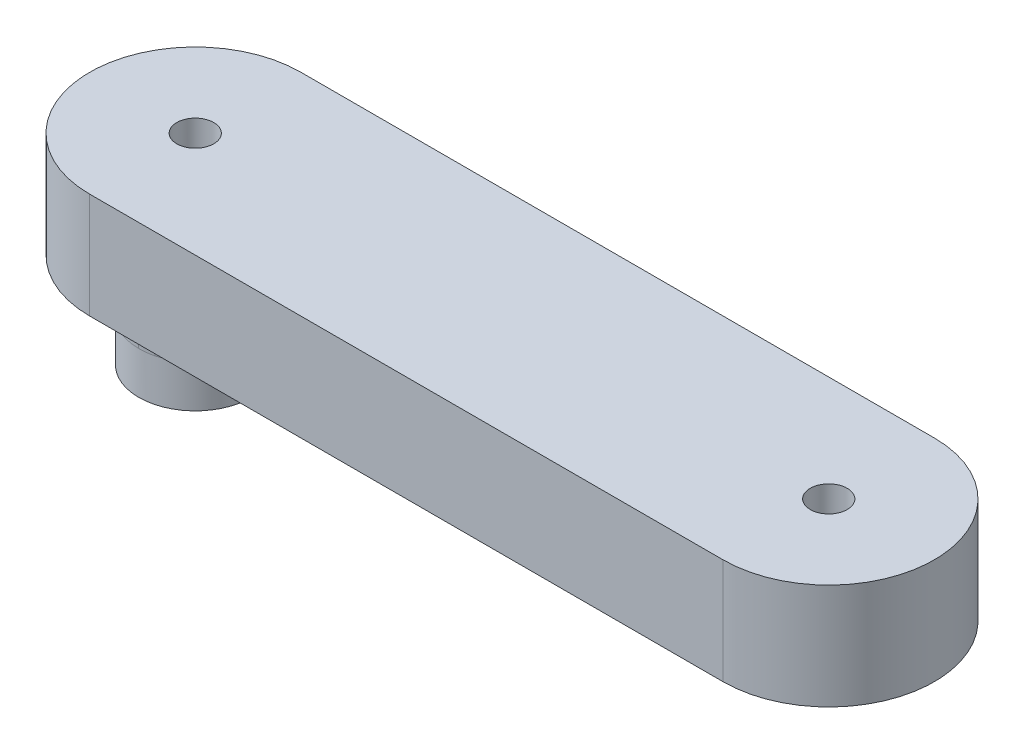
ISO-10303-21;
HEADER;
FILE_DESCRIPTION(('STEP AP214'),'2;1');
FILE_NAME('part.step','',(''),(''),'','','');
FILE_SCHEMA(('AUTOMOTIVE_DESIGN { 1 0 10303 214 1 1 1 1 }'));
ENDSEC;
DATA;
#1=APPLICATION_CONTEXT('core data for automotive mechanical design processes');
#2=APPLICATION_PROTOCOL_DEFINITION('international standard','automotive_design',2000,#1);
#3=PRODUCT_CONTEXT('',#1,'mechanical');
#4=PRODUCT('Part','Part','',(#3));
#5=PRODUCT_RELATED_PRODUCT_CATEGORY('part','',(#4));
#6=PRODUCT_DEFINITION_FORMATION('','',#4);
#7=PRODUCT_DEFINITION_CONTEXT('part definition',#1,'design');
#8=PRODUCT_DEFINITION('design','',#6,#7);
#9=PRODUCT_DEFINITION_SHAPE('','',#8);
#10=(LENGTH_UNIT() NAMED_UNIT(*) SI_UNIT(.MILLI.,.METRE.));
#11=(NAMED_UNIT(*) PLANE_ANGLE_UNIT() SI_UNIT($,.RADIAN.));
#12=(NAMED_UNIT(*) SI_UNIT($,.STERADIAN.) SOLID_ANGLE_UNIT());
#13=UNCERTAINTY_MEASURE_WITH_UNIT(LENGTH_MEASURE(1.E-05),#10,'distance_accuracy_value','');
#14=(GEOMETRIC_REPRESENTATION_CONTEXT(3) GLOBAL_UNCERTAINTY_ASSIGNED_CONTEXT((#13)) GLOBAL_UNIT_ASSIGNED_CONTEXT((#10,
#11,#12)) REPRESENTATION_CONTEXT('',''));
#15=CARTESIAN_POINT('',(0.,0.,0.));
#16=DIRECTION('',(0.,0.,1.));
#17=DIRECTION('',(1.,0.,0.));
#18=AXIS2_PLACEMENT_3D('',#15,#16,#17);
#19=CARTESIAN_POINT('',(-30.,10.,0.));
#20=DIRECTION('',(0.,-1.,0.));
#21=DIRECTION('',(0.,0.,1.));
#22=AXIS2_PLACEMENT_3D('',#19,#20,#21);
#23=CYLINDRICAL_SURFACE('',#22,10.);
#24=CARTESIAN_POINT('',(-30.,0.,0.));
#25=DIRECTION('',(0.,-1.,0.));
#26=DIRECTION('',(0.,0.,-1.));
#27=AXIS2_PLACEMENT_3D('',#24,#25,#26);
#28=CIRCLE('',#27,10.);
#29=CARTESIAN_POINT('',(-30.,0.,10.));
#30=VERTEX_POINT('',#29);
#31=CARTESIAN_POINT('',(-30.,0.,-10.));
#32=VERTEX_POINT('',#31);
#33=EDGE_CURVE('E149',#30,#32,#28,.T.);
#34=ORIENTED_EDGE('',*,*,#33,.F.);
#35=DIRECTION('',(0.,-1.,0.));
#36=VECTOR('',#35,1.);
#37=CARTESIAN_POINT('',(-30.,10.,10.));
#38=LINE('',#37,#36);
#39=CARTESIAN_POINT('',(-30.,10.,10.));
#40=VERTEX_POINT('',#39);
#41=EDGE_CURVE('E136',#40,#30,#38,.T.);
#42=ORIENTED_EDGE('',*,*,#41,.F.);
#43=CARTESIAN_POINT('',(-30.,10.,0.));
#44=DIRECTION('',(0.,-1.,0.));
#45=DIRECTION('',(0.,0.,-1.));
#46=AXIS2_PLACEMENT_3D('',#43,#44,#45);
#47=CIRCLE('',#46,10.);
#48=CARTESIAN_POINT('',(-30.,10.,-10.));
#49=VERTEX_POINT('',#48);
#50=EDGE_CURVE('E114',#40,#49,#47,.T.);
#51=ORIENTED_EDGE('',*,*,#50,.T.);
#52=DIRECTION('',(0.,-1.,0.));
#53=VECTOR('',#52,1.);
#54=CARTESIAN_POINT('',(-30.,10.,-10.));
#55=LINE('',#54,#53);
#56=EDGE_CURVE('E124',#49,#32,#55,.T.);
#57=ORIENTED_EDGE('',*,*,#56,.T.);
#58=EDGE_LOOP('',(#34,#42,#51,#57));
#59=FACE_BOUND('',#58,.T.);
#60=ADVANCED_FACE('F45',(#59),#23,.T.);
#61=CARTESIAN_POINT('',(-30.,10.,-10.));
#62=DIRECTION('',(0.,0.,1.));
#63=DIRECTION('',(-1.,0.,0.));
#64=AXIS2_PLACEMENT_3D('',#61,#62,#63);
#65=PLANE('',#64);
#66=DIRECTION('',(1.,0.,0.));
#67=VECTOR('',#66,1.);
#68=CARTESIAN_POINT('',(-30.,0.,-10.));
#69=LINE('',#68,#67);
#70=CARTESIAN_POINT('',(-27.3311987709835,0.,-10.));
#71=VERTEX_POINT('',#70);
#72=EDGE_CURVE('E128',#32,#71,#69,.T.);
#73=ORIENTED_EDGE('',*,*,#72,.F.);
#74=ORIENTED_EDGE('',*,*,#56,.F.);
#75=DIRECTION('',(1.,0.,0.));
#76=VECTOR('',#75,1.);
#77=CARTESIAN_POINT('',(-30.,10.,-10.));
#78=LINE('',#77,#76);
#79=CARTESIAN_POINT('',(30.,10.,-9.99999999999999));
#80=VERTEX_POINT('',#79);
#81=EDGE_CURVE('E110',#49,#80,#78,.T.);
#82=ORIENTED_EDGE('',*,*,#81,.T.);
#83=DIRECTION('',(0.,-1.,0.));
#84=VECTOR('',#83,1.);
#85=CARTESIAN_POINT('',(30.,10.,-9.99999999999999));
#86=LINE('',#85,#84);
#87=CARTESIAN_POINT('',(30.,0.,-9.99999999999999));
#88=VERTEX_POINT('',#87);
#89=EDGE_CURVE('E133',#80,#88,#86,.T.);
#90=ORIENTED_EDGE('',*,*,#89,.T.);
#91=EDGE_CURVE('E151',#71,#88,#69,.T.);
#92=ORIENTED_EDGE('',*,*,#91,.F.);
#93=EDGE_LOOP('',(#73,#74,#82,#90,#92));
#94=FACE_BOUND('',#93,.T.);
#95=ADVANCED_FACE('F125',(#94),#65,.F.);
#96=CARTESIAN_POINT('',(30.,10.,0.));
#97=DIRECTION('',(0.,-1.,0.));
#98=DIRECTION('',(0.,0.,1.));
#99=AXIS2_PLACEMENT_3D('',#96,#97,#98);
#100=CYLINDRICAL_SURFACE('',#99,10.);
#101=CARTESIAN_POINT('',(30.,0.,0.));
#102=DIRECTION('',(0.,-1.,0.));
#103=DIRECTION('',(0.,0.,-1.));
#104=AXIS2_PLACEMENT_3D('',#101,#102,#103);
#105=CIRCLE('',#104,10.);
#106=CARTESIAN_POINT('',(30.,0.,10.));
#107=VERTEX_POINT('',#106);
#108=EDGE_CURVE('E153',#88,#107,#105,.T.);
#109=ORIENTED_EDGE('',*,*,#108,.F.);
#110=ORIENTED_EDGE('',*,*,#89,.F.);
#111=CARTESIAN_POINT('',(30.,10.,0.));
#112=DIRECTION('',(0.,-1.,0.));
#113=DIRECTION('',(0.,0.,-1.));
#114=AXIS2_PLACEMENT_3D('',#111,#112,#113);
#115=CIRCLE('',#114,10.);
#116=CARTESIAN_POINT('',(30.,10.,10.));
#117=VERTEX_POINT('',#116);
#118=EDGE_CURVE('E117',#80,#117,#115,.T.);
#119=ORIENTED_EDGE('',*,*,#118,.T.);
#120=DIRECTION('',(0.,-1.,0.));
#121=VECTOR('',#120,1.);
#122=CARTESIAN_POINT('',(30.,10.,10.));
#123=LINE('',#122,#121);
#124=EDGE_CURVE('E157',#117,#107,#123,.T.);
#125=ORIENTED_EDGE('',*,*,#124,.T.);
#126=EDGE_LOOP('',(#109,#110,#119,#125));
#127=FACE_BOUND('',#126,.T.);
#128=ADVANCED_FACE('F231',(#127),#100,.T.);
#129=CARTESIAN_POINT('',(-30.,10.,10.));
#130=DIRECTION('',(0.,0.,-1.));
#131=DIRECTION('',(1.,0.,0.));
#132=AXIS2_PLACEMENT_3D('',#129,#130,#131);
#133=PLANE('',#132);
#134=DIRECTION('',(-1.,0.,0.));
#135=VECTOR('',#134,1.);
#136=CARTESIAN_POINT('',(-30.,0.,10.));
#137=LINE('',#136,#135);
#138=CARTESIAN_POINT('',(-27.3311987709835,0.,10.));
#139=VERTEX_POINT('',#138);
#140=EDGE_CURVE('E137',#107,#139,#137,.T.);
#141=ORIENTED_EDGE('',*,*,#140,.F.);
#142=ORIENTED_EDGE('',*,*,#124,.F.);
#143=DIRECTION('',(-1.,0.,0.));
#144=VECTOR('',#143,1.);
#145=CARTESIAN_POINT('',(-30.,10.,10.));
#146=LINE('',#145,#144);
#147=EDGE_CURVE('E147',#117,#40,#146,.T.);
#148=ORIENTED_EDGE('',*,*,#147,.T.);
#149=ORIENTED_EDGE('',*,*,#41,.T.);
#150=EDGE_CURVE('E140',#139,#30,#137,.T.);
#151=ORIENTED_EDGE('',*,*,#150,.F.);
#152=EDGE_LOOP('',(#141,#142,#148,#149,#151));
#153=FACE_BOUND('',#152,.T.);
#154=ADVANCED_FACE('F205',(#153),#133,.F.);
#155=CARTESIAN_POINT('',(-30.,10.,0.));
#156=DIRECTION('',(0.,1.,0.));
#157=DIRECTION('',(0.,0.,-1.));
#158=AXIS2_PLACEMENT_3D('',#155,#156,#157);
#159=PLANE('',#158);
#160=CARTESIAN_POINT('',(-30.,10.,0.));
#161=DIRECTION('',(0.,-1.,0.));
#162=DIRECTION('',(0.,0.,-1.));
#163=AXIS2_PLACEMENT_3D('',#160,#161,#162);
#164=CIRCLE('',#163,1.75);
#165=CARTESIAN_POINT('',(-30.,10.,-1.75));
#166=VERTEX_POINT('',#165);
#167=EDGE_CURVE('E349',#166,#166,#164,.F.);
#168=ORIENTED_EDGE('',*,*,#167,.F.);
#169=EDGE_LOOP('',(#168));
#170=FACE_BOUND('',#169,.T.);
#171=CARTESIAN_POINT('',(30.,10.,0.));
#172=DIRECTION('',(0.,-1.,0.));
#173=DIRECTION('',(0.,0.,-1.));
#174=AXIS2_PLACEMENT_3D('',#171,#172,#173);
#175=CIRCLE('',#174,1.75);
#176=CARTESIAN_POINT('',(30.,10.,-1.74999999999999));
#177=VERTEX_POINT('',#176);
#178=EDGE_CURVE('E359',#177,#177,#175,.T.);
#179=ORIENTED_EDGE('',*,*,#178,.T.);
#180=EDGE_LOOP('',(#179));
#181=FACE_BOUND('',#180,.T.);
#182=ORIENTED_EDGE('',*,*,#50,.F.);
#183=ORIENTED_EDGE('',*,*,#147,.F.);
#184=ORIENTED_EDGE('',*,*,#118,.F.);
#185=ORIENTED_EDGE('',*,*,#81,.F.);
#186=EDGE_LOOP('',(#182,#183,#184,#185));
#187=FACE_BOUND('',#186,.T.);
#188=ADVANCED_FACE('F112',(#170,#181,#187),#159,.T.);
#189=CARTESIAN_POINT('',(-30.,0.,0.));
#190=DIRECTION('',(0.,1.,0.));
#191=DIRECTION('',(0.,0.,-1.));
#192=AXIS2_PLACEMENT_3D('',#189,#190,#191);
#193=PLANE('',#192);
#194=CARTESIAN_POINT('',(30.,0.,0.));
#195=DIRECTION('',(0.,-1.,0.));
#196=DIRECTION('',(0.,0.,-1.));
#197=AXIS2_PLACEMENT_3D('',#194,#195,#196);
#198=CIRCLE('',#197,1.75);
#199=CARTESIAN_POINT('',(30.,0.,-1.74999999999999));
#200=VERTEX_POINT('',#199);
#201=EDGE_CURVE('E143',#200,#200,#198,.F.);
#202=ORIENTED_EDGE('',*,*,#201,.T.);
#203=EDGE_LOOP('',(#202));
#204=FACE_BOUND('',#203,.T.);
#205=ORIENTED_EDGE('',*,*,#91,.T.);
#206=ORIENTED_EDGE('',*,*,#108,.T.);
#207=ORIENTED_EDGE('',*,*,#140,.T.);
#208=CARTESIAN_POINT('',(-30.,0.,0.));
#209=DIRECTION('',(0.,-1.,0.));
#210=DIRECTION('',(0.,0.,-1.));
#211=AXIS2_PLACEMENT_3D('',#208,#209,#210);
#212=CIRCLE('',#211,10.35);
#213=EDGE_CURVE('E11',#71,#139,#212,.T.);
#214=ORIENTED_EDGE('',*,*,#213,.F.);
#215=EDGE_LOOP('',(#205,#206,#207,#214));
#216=FACE_BOUND('',#215,.T.);
#217=ADVANCED_FACE('F208',(#204,#216),#193,.F.);
#218=CARTESIAN_POINT('',(30.,-0.000999999999999265,0.));
#219=DIRECTION('',(0.,1.,0.));
#220=DIRECTION('',(0.,0.,-1.));
#221=AXIS2_PLACEMENT_3D('',#218,#219,#220);
#222=CYLINDRICAL_SURFACE('',#221,1.75);
#223=ORIENTED_EDGE('',*,*,#178,.F.);
#224=EDGE_LOOP('',(#223));
#225=FACE_BOUND('',#224,.T.);
#226=ORIENTED_EDGE('',*,*,#201,.F.);
#227=EDGE_LOOP('',(#226));
#228=FACE_BOUND('',#227,.T.);
#229=ADVANCED_FACE('F182',(#225,#228),#222,.F.);
#230=CARTESIAN_POINT('',(-30.,-9.,0.));
#231=DIRECTION('',(0.,1.,0.));
#232=DIRECTION('',(0.,0.,-1.));
#233=AXIS2_PLACEMENT_3D('',#230,#231,#232);
#234=CYLINDRICAL_SURFACE('',#233,5.35);
#235=CARTESIAN_POINT('',(-30.,-5.,0.));
#236=DIRECTION('',(0.,-1.,0.));
#237=DIRECTION('',(0.,0.,-1.));
#238=AXIS2_PLACEMENT_3D('',#235,#236,#237);
#239=CIRCLE('',#238,5.35);
#240=CARTESIAN_POINT('',(-28.6204747270301,-5.,5.16908212560387));
#241=VERTEX_POINT('',#240);
#242=CARTESIAN_POINT('',(-28.6204747270301,-5.,-5.16908212560387));
#243=VERTEX_POINT('',#242);
#244=EDGE_CURVE('E132',#241,#243,#239,.F.);
#245=ORIENTED_EDGE('',*,*,#244,.F.);
#246=CARTESIAN_POINT('',(-31.9788555023003,0.,10.));
#247=CARTESIAN_POINT('',(-31.0518342041425,-0.151327584497428,5.24566626475481));
#248=CARTESIAN_POINT('',(-31.0228866606093,-4.99746914629356,5.25130487398585));
#249=CARTESIAN_POINT('',(-31.8416840938048,0.,10.));
#250=CARTESIAN_POINT('',(-30.9838925193806,-0.17627521969813,5.25932344975121));
#251=CARTESIAN_POINT('',(-30.9519816330296,-4.99661173471191,5.26511615605325));
#252=CARTESIAN_POINT('',(-31.7039879760669,0.,10.));
#253=CARTESIAN_POINT('',(-30.9139269500573,-0.198492678012402,5.27196649699026));
#254=CARTESIAN_POINT('',(-30.8808053789332,-4.9956432876798,5.27748969279492));
#255=CARTESIAN_POINT('',(-31.4277388486444,0.,10.));
#256=CARTESIAN_POINT('',(-30.7712171581687,-0.237452741214783,5.29471475920545));
#257=CARTESIAN_POINT('',(-30.7380099362557,-4.99369141658507,5.29934522958744));
#258=CARTESIAN_POINT('',(-31.2891858339339,0.,10.));
#259=CARTESIAN_POINT('',(-30.6984091257832,-0.254238109499984,5.30484226443355));
#260=CARTESIAN_POINT('',(-30.6663907450769,-4.99270799243456,5.30882721266284));
#261=CARTESIAN_POINT('',(-30.8726298347986,0.,10.));
#262=CARTESIAN_POINT('',(-30.4773319962797,-0.296564774639448,5.33077347696277));
#263=CARTESIAN_POINT('',(-30.4510695281324,-4.99004653847853,5.33290592711733));
#264=CARTESIAN_POINT('',(-30.5936336521263,0.,10.));
#265=CARTESIAN_POINT('',(-30.3252574445491,-0.314398026885512,5.34231726020473));
#266=CARTESIAN_POINT('',(-30.3068541100363,-4.98865643752529,5.34314510868886));
#267=CARTESIAN_POINT('',(-30.0421292001654,0.,10.));
#268=CARTESIAN_POINT('',(-30.0234398128161,-0.329434998305688,5.35201856702636));
#269=CARTESIAN_POINT('',(-30.0217769295541,-4.98749388985973,5.35180766924487));
#270=CARTESIAN_POINT('',(-29.7696373967144,0.,10.));
#271=CARTESIAN_POINT('',(-29.8731180834523,-0.327217293838507,5.35055142617128));
#272=CARTESIAN_POINT('',(-29.880923678495,-4.98768099912332,5.35052640691505));
#273=CARTESIAN_POINT('',(-29.2256849883891,0.,10.));
#274=CARTESIAN_POINT('',(-29.576495502657,-0.303458308736667,5.33532802825332));
#275=CARTESIAN_POINT('',(-29.5997502113895,-4.989470825283,5.33686337690267));
#276=CARTESIAN_POINT('',(-28.9542244296997,0.,10.));
#277=CARTESIAN_POINT('',(-29.4295879130413,-0.281817197515285,5.32150804622998));
#278=CARTESIAN_POINT('',(-29.4594300192165,-4.9910736048473,5.3244811178061));
#279=CARTESIAN_POINT('',(-28.3996316922226,0.,10.));
#280=CARTESIAN_POINT('',(-29.1377340144726,-0.216815216529237,5.28234281094893));
#281=CARTESIAN_POINT('',(-29.1727564785887,-4.99486237568772,5.28773553453734));
#282=CARTESIAN_POINT('',(-28.1166486098413,0.,10.));
#283=CARTESIAN_POINT('',(-28.9927750299324,-0.172067422348054,5.256259441982));
#284=CARTESIAN_POINT('',(-29.0264801992908,-4.99707489892725,5.2627687936572));
#285=CARTESIAN_POINT('',(-27.5556843173356,0.,10.));
#286=CARTESIAN_POINT('',(-28.7201965933415,-0.0589137193665695,5.19658457594004));
#287=CARTESIAN_POINT('',(-28.7365131495399,-4.99998286469731,5.20077750969058));
#288=CARTESIAN_POINT('',(-27.2777029505943,0.,10.));
#289=CARTESIAN_POINT('',(-28.5921846311864,0.0100164515104568,5.16277477656473));
#290=CARTESIAN_POINT('',(-28.5928222981303,-5.00067835481242,5.16375334484967));
#291=CARTESIAN_POINT('',(-26.720969453793,0.,10.));
#292=CARTESIAN_POINT('',(-28.3571871109459,0.175551584476236,5.09328951321567));
#293=CARTESIAN_POINT('',(-28.3050421814322,-4.99753497146377,5.0766944689985));
#294=CARTESIAN_POINT('',(-26.4424108985969,0.,10.));
#295=CARTESIAN_POINT('',(-28.2508597913106,0.273634993526015,5.05743919766299));
#296=CARTESIAN_POINT('',(-28.1610529765808,-4.99356945320689,5.02632655407054));
#297=CARTESIAN_POINT('',(-26.031737923125,0.,10.));
#298=CARTESIAN_POINT('',(-28.1172209488664,0.440573720836216,5.01123762346318));
#299=CARTESIAN_POINT('',(-27.9487727428786,-4.98091755986846,4.94173859701554));
#300=CARTESIAN_POINT('',(-25.8959926334928,0.,10.));
#301=CARTESIAN_POINT('',(-28.0766921001863,0.500169151962237,4.99699131325034));
#302=CARTESIAN_POINT('',(-27.8786048878471,-4.97557980590995,4.9120240472642));
#303=CARTESIAN_POINT('',(-25.6271790249498,0.,10.));
#304=CARTESIAN_POINT('',(-28.0050059401995,0.626198699088738,4.97275664154473));
#305=CARTESIAN_POINT('',(-27.7396529259375,-4.96203528700234,4.84965282784346));
#306=CARTESIAN_POINT('',(-25.4941111163786,0.,10.));
#307=CARTESIAN_POINT('',(-27.9739300041018,0.692765411267941,4.96280867491815));
#308=CARTESIAN_POINT('',(-27.6708690311674,-4.95382808576641,4.81699571133053));
#309=CARTESIAN_POINT('',(-25.3625284338882,0.,10.));
#310=CARTESIAN_POINT('',(-27.9482532363106,0.76221763904271,4.95601696890614));
#311=CARTESIAN_POINT('',(-27.6028528619615,-4.94387071662594,4.78290556028382));
#312=(BOUNDED_SURFACE() B_SPLINE_SURFACE(3,2,((#246,#247,#248),(#249,#250,#251),(#252,#253,
#254),(#255,#256,#257),(#258,#259,#260),(#261,#262,#263),(#264,#265,#266),(#267,#268,#269),
(#270,#271,#272),(#273,#274,#275),(#276,#277,#278),(#279,#280,#281),(#282,#283,#284),(#285,#286,
#287),(#288,#289,#290),(#291,#292,#293),(#294,#295,#296),(#297,#298,#299),(#300,#301,#302),
(#303,#304,#305),(#306,#307,#308),(#309,#310,#311)),.UNSPECIFIED.,.F.,.F.,
.F.) B_SPLINE_SURFACE_WITH_KNOTS((4,2,2,2,2,2,2,2,2,2,4),(3,3),(0.,0.419195440622891,
0.838393342170593,1.67649585344164,2.49317378017278,3.30988786102549,4.17013299968639,
5.03035115475905,5.91449315288709,6.35688857993051,6.7993513005261),(0.,1.),
.UNSPECIFIED.) GEOMETRIC_REPRESENTATION_ITEM() RATIONAL_B_SPLINE_SURFACE(((1.,0.718062116433734,
1.),(1.,0.719917164011899,1.),(1.,0.72158575518807,1.),(1.,0.72454097111007,1.),(1.,
0.725827593613473,1.),(1.,0.72910013465956,1.),(1.,0.730500037216757,1.),(1.,0.731683955318959,
1.),(1.,0.731508363306906,1.),(1.,0.729642437825001,1.),(1.,0.727952037298279,1.),(1.,
0.722966735302252,1.),(1.,0.71959111583058,1.),(1.,0.711296811271779,1.),(1.,0.706378174589809,
1.),(1.,0.694983923227657,1.),(1.,0.688468811289003,1.),(1.,0.677760266484751,1.),(1.,
0.674033234201927,1.),(1.,0.666305585787939,1.),(1.,0.662304928127688,1.),(1.,0.658187012948064,1.))) REPRESENTATION_ITEM('') SURFACE());
#313=CARTESIAN_POINT('',(-31.0228866606093,-4.99746914629356,5.25130487398585));
#314=CARTESIAN_POINT('',(-30.9519816330296,-4.99661173471191,5.26511615605325));
#315=CARTESIAN_POINT('',(-30.8808053789332,-4.9956432876798,5.27748969279492));
#316=CARTESIAN_POINT('',(-30.7380099362557,-4.99369141658507,5.29934522958744));
#317=CARTESIAN_POINT('',(-30.6663907450769,-4.99270799243456,5.30882721266284));
#318=CARTESIAN_POINT('',(-30.4510695281324,-4.99004653847853,5.33290592711733));
#319=CARTESIAN_POINT('',(-30.3068541100362,-4.98865643752529,5.34314510868887));
#320=CARTESIAN_POINT('',(-30.0217769295541,-4.98749388985973,5.35180766924487));
#321=CARTESIAN_POINT('',(-29.880923678495,-4.98768099912332,5.35052640691505));
#322=CARTESIAN_POINT('',(-29.5997502113895,-4.989470825283,5.33686337690267));
#323=CARTESIAN_POINT('',(-29.4594300192165,-4.9910736048473,5.3244811178061));
#324=CARTESIAN_POINT('',(-29.1727564785887,-4.99486237568772,5.28773553453734));
#325=CARTESIAN_POINT('',(-29.0264801992908,-4.99707489892725,5.2627687936572));
#326=CARTESIAN_POINT('',(-28.7365131495399,-4.99998286469731,5.20077750969058));
#327=CARTESIAN_POINT('',(-28.5928222981303,-5.00067835481242,5.16375334484967));
#328=CARTESIAN_POINT('',(-28.3050421814322,-4.99753497146377,5.0766944689985));
#329=CARTESIAN_POINT('',(-28.1610529765808,-4.99356945320689,5.02632655407054));
#330=CARTESIAN_POINT('',(-27.9487727428786,-4.98091755986846,4.94173859701554));
#331=CARTESIAN_POINT('',(-27.8786048878471,-4.97557980590995,4.9120240472642));
#332=CARTESIAN_POINT('',(-27.7396529259375,-4.96203528700234,4.84965282784346));
#333=CARTESIAN_POINT('',(-27.6708690311674,-4.95382808576641,4.81699571133053));
#334=CARTESIAN_POINT('',(-27.6028528619615,-4.94387071662594,4.78290556028382));
#335=B_SPLINE_CURVE_WITH_KNOTS('',3,(#313,#314,#315,#316,#317,#318,#319,#320,#321,#322,#323,
#324,#325,#326,#327,#328,#329,#330,#331,#332,#333,#334),.UNSPECIFIED.,.F.,.F.,(4,2,2,2,2,2,2,2,
2,2,4),(0.,0.419195440622891,0.838393342170593,1.67649585344164,2.49317378017278,
3.30988786102549,4.17013299968639,5.03035115475905,5.91449315288709,6.35688857993051,
6.7993513005261),.UNSPECIFIED.);
#336=CARTESIAN_POINT('',(-30.,-4.98773495687171,5.35));
#337=VERTEX_POINT('',#336);
#338=EDGE_CURVE('E162',#337,#241,#335,.T.);
#339=ORIENTED_EDGE('',*,*,#338,.F.);
#340=CARTESIAN_POINT('',(-30.,-4.98773495687171,0.));
#341=DIRECTION('',(0.,-1.,0.));
#342=DIRECTION('',(0.,0.,-1.));
#343=AXIS2_PLACEMENT_3D('',#340,#341,#342);
#344=CIRCLE('',#343,5.35);
#345=CARTESIAN_POINT('',(-30.,-4.98773495687171,-5.35));
#346=VERTEX_POINT('',#345);
#347=EDGE_CURVE('E170',#346,#337,#344,.F.);
#348=ORIENTED_EDGE('',*,*,#347,.F.);
#349=CARTESIAN_POINT('',(-24.982329250762,0.,-10.));
#350=CARTESIAN_POINT('',(-27.8879748506339,0.975498043250481,-4.94622203647995));
#351=CARTESIAN_POINT('',(-27.4063247817948,-4.90937934062816,-4.67924661270043));
#352=CARTESIAN_POINT('',(-25.1018149149591,0.,-10.));
#353=CARTESIAN_POINT('',(-27.9020255513305,0.905271442460553,-4.9457728156593));
#354=CARTESIAN_POINT('',(-27.4680879028949,-4.92215702125141,-4.7134828290892));
#355=CARTESIAN_POINT('',(-25.2227372258345,0.,-10.));
#356=CARTESIAN_POINT('',(-27.9210674061778,0.837164866416161,-4.94901573193148));
#357=CARTESIAN_POINT('',(-27.5305936384705,-4.93311468699,-4.74652914754896));
#358=CARTESIAN_POINT('',(-25.4671924458317,0.,-10.));
#359=CARTESIAN_POINT('',(-27.9683167428165,0.706727456995857,-4.96116416599632));
#360=CARTESIAN_POINT('',(-27.6569545492993,-4.95194389528001,-4.81016000486057));
#361=CARTESIAN_POINT('',(-25.5907248833673,0.,-10.));
#362=CARTESIAN_POINT('',(-27.996430695619,0.64429078852622,-4.97000691203827));
#363=CARTESIAN_POINT('',(-27.7208094807857,-4.95981599037782,-4.84074498369482));
#364=CARTESIAN_POINT('',(-25.9646644125965,0.,-10.));
#365=CARTESIAN_POINT('',(-28.0928174155574,0.467291109513014,-5.00221179667532));
#366=CARTESIAN_POINT('',(-27.914101894452,-4.9796272877734,-4.92864537441296));
#367=CARTESIAN_POINT('',(-26.218648483424,0.,-10.));
#368=CARTESIAN_POINT('',(-28.1738131629906,0.36035783012853,-5.03140402812188));
#369=CARTESIAN_POINT('',(-28.045388346509,-4.9877843263485,-4.98217352822328));
#370=CARTESIAN_POINT('',(-26.7277497753456,0.,-10.));
#371=CARTESIAN_POINT('',(-28.3603007018644,0.174145036372328,-5.09358181809736));
#372=CARTESIAN_POINT('',(-28.3085469853189,-4.99768796878871,-5.07745985956556));
#373=CARTESIAN_POINT('',(-26.9826861426235,0.,-10.));
#374=CARTESIAN_POINT('',(-28.4649516265539,0.0935749025152563,-5.1264658155242));
#375=CARTESIAN_POINT('',(-28.4403256872486,-4.99958701406536,-5.11947470033271));
#376=CARTESIAN_POINT('',(-27.4981355022676,0.,-10.));
#377=CARTESIAN_POINT('',(-28.6933077655576,-0.044837079806402,-5.18928403448164));
#378=CARTESIAN_POINT('',(-28.7067656944101,-5.00029124399042,-5.19318317312786));
#379=CARTESIAN_POINT('',(-27.7586494453069,0.,-10.));
#380=CARTESIAN_POINT('',(-28.8171590642594,-0.103227899936854,-5.21936847159637));
#381=CARTESIAN_POINT('',(-28.8414274910527,-4.99909589698226,-5.22487503048074));
#382=CARTESIAN_POINT('',(-28.2885221906524,0.,-10.));
#383=CARTESIAN_POINT('',(-29.0802845511431,-0.199835553334218,-5.27218728131988));
#384=CARTESIAN_POINT('',(-29.1153230647331,-4.99581213660066,-5.27822633599849));
#385=CARTESIAN_POINT('',(-28.5579553791874,0.,-10.));
#386=CARTESIAN_POINT('',(-29.2202075943135,-0.238070156897065,-5.29496276846834));
#387=CARTESIAN_POINT('',(-29.2545952926233,-4.99370752498329,-5.29968820730515));
#388=CARTESIAN_POINT('',(-29.0992422335306,0.,-10.));
#389=CARTESIAN_POINT('',(-29.5075631984335,-0.29421232905778,-5.3293078754699));
#390=CARTESIAN_POINT('',(-29.5343909129845,-4.99020537825828,-5.33156033600395));
#391=CARTESIAN_POINT('',(-29.371095809923,0.,-10.));
#392=CARTESIAN_POINT('',(-29.6555353138538,-0.312355351759312,-5.34101420045177));
#393=CARTESIAN_POINT('',(-29.6749142592356,-4.98880781713959,-5.34197099996452));
#394=CARTESIAN_POINT('',(-29.9225253777918,0.,-10.));
#395=CARTESIAN_POINT('',(-29.9571017441589,-0.32941874631264,-5.35199488366776));
#396=CARTESIAN_POINT('',(-29.9599527315155,-4.98750073565179,-5.35179776405821));
#397=CARTESIAN_POINT('',(-30.2021216190016,0.,-10.));
#398=CARTESIAN_POINT('',(-30.111405781805,-0.327912126433173,-5.35099298670278));
#399=CARTESIAN_POINT('',(-30.1044783247979,-4.98763004344254,-5.35092692281945));
#400=CARTESIAN_POINT('',(-30.620677637691,0.,-10.));
#401=CARTESIAN_POINT('',(-30.3396172782977,-0.310420525479363,-5.33979122345231));
#402=CARTESIAN_POINT('',(-30.320833368275,-4.98894637096784,-5.340860003256));
#403=CARTESIAN_POINT('',(-30.7600818225309,0.,-10.));
#404=CARTESIAN_POINT('',(-30.4153552384296,-0.30202592941477,-5.33442455139388));
#405=CARTESIAN_POINT('',(-30.3928925362841,-4.98957242342615,-5.33604258314774));
#406=CARTESIAN_POINT('',(-31.0383967397009,0.,-10.));
#407=CARTESIAN_POINT('',(-30.5651430873869,-0.280067579465134,-5.3206780454283));
#408=CARTESIAN_POINT('',(-30.5367558026473,-4.99108186619892,-5.32349558536303));
#409=CARTESIAN_POINT('',(-31.1773074746799,0.,-10.));
#410=CARTESIAN_POINT('',(-30.6392701624221,-0.266479800947126,-5.31228369439716));
#411=CARTESIAN_POINT('',(-30.6085599023708,-4.99196525512984,-5.31576602334332));
#412=CARTESIAN_POINT('',(-31.3158737889103,0.,-10.));
#413=CARTESIAN_POINT('',(-30.7120499996823,-0.250271465370146,-5.30250099440117));
#414=CARTESIAN_POINT('',(-30.6801859681807,-4.99291881518917,-5.3065852531256));
#415=(BOUNDED_SURFACE() B_SPLINE_SURFACE(3,2,((#349,#350,#351),(#352,#353,#354),(#355,#356,
#357),(#358,#359,#360),(#361,#362,#363),(#364,#365,#366),(#367,#368,#369),(#370,#371,#372),
(#373,#374,#375),(#376,#377,#378),(#379,#380,#381),(#382,#383,#384),(#385,#386,#387),(#388,#389,
#390),(#391,#392,#393),(#394,#395,#396),(#397,#398,#399),(#400,#401,#402),(#403,#404,#405),
(#406,#407,#408),(#409,#410,#411),(#412,#413,#414)),.UNSPECIFIED.,.F.,.F.,
.F.) B_SPLINE_SURFACE_WITH_KNOTS((4,2,2,2,2,2,2,2,2,2,4),(3,3),(0.,0.411542741492992,
0.82301175255332,1.645144449525,2.44709631854861,3.24918598240891,4.06619522460136,
4.88317440838842,5.72097312572852,6.14002468851432,6.55907399835985),(0.,1.),
.UNSPECIFIED.) GEOMETRIC_REPRESENTATION_ITEM() RATIONAL_B_SPLINE_SURFACE(((1.,0.645846913338497,
1.),(1.,0.649862634729996,1.),(1.,0.653798780730084,1.),(1.,0.661474206336515,1.),(1.,
0.665213521086353,1.),(1.,0.676074699999644,1.),(1.,0.682847801331046,1.),(1.,0.695078749137499,
1.),(1.,0.700564799930277,1.),(1.,0.710281907038307,1.),(1.,0.714512747553014,1.),(1.,
0.721677506720577,1.),(1.,0.724585837636818,1.),(1.,0.728916944876097,1.),(1.,0.730339775849909,
1.),(1.,0.731682421614335,1.),(1.,0.731563010207267,1.),(1.,0.730188276238598,1.),(1.,
0.72953053405369,1.),(1.,0.727821334129289,1.),(1.,0.726769878506541,1.),(1.,0.725524091352782,1.))) REPRESENTATION_ITEM('') SURFACE());
#416=CARTESIAN_POINT('',(-27.4063247817948,-4.90937934062816,-4.67924661270043));
#417=CARTESIAN_POINT('',(-27.4680879028949,-4.92215702125141,-4.7134828290892));
#418=CARTESIAN_POINT('',(-27.5305936384705,-4.93311468699,-4.74652914754896));
#419=CARTESIAN_POINT('',(-27.6569545492993,-4.95194389528001,-4.81016000486057));
#420=CARTESIAN_POINT('',(-27.7208094807857,-4.95981599037782,-4.84074498369482));
#421=CARTESIAN_POINT('',(-27.914101894452,-4.9796272877734,-4.92864537441296));
#422=CARTESIAN_POINT('',(-28.045388346509,-4.9877843263485,-4.98217352822328));
#423=CARTESIAN_POINT('',(-28.3085469853189,-4.99768796878871,-5.07745985956556));
#424=CARTESIAN_POINT('',(-28.4403256872486,-4.99958701406536,-5.11947470033271));
#425=CARTESIAN_POINT('',(-28.7067656944101,-5.00029124399043,-5.19318317312786));
#426=CARTESIAN_POINT('',(-28.8414274910527,-4.99909589698226,-5.22487503048074));
#427=CARTESIAN_POINT('',(-29.115323064733,-4.99581213660066,-5.27822633599849));
#428=CARTESIAN_POINT('',(-29.2545952926233,-4.99370752498329,-5.29968820730515));
#429=CARTESIAN_POINT('',(-29.5343909129845,-4.99020537825828,-5.33156033600395));
#430=CARTESIAN_POINT('',(-29.6749142592356,-4.98880781713959,-5.34197099996452));
#431=CARTESIAN_POINT('',(-29.9599527315155,-4.98750073565179,-5.35179776405821));
#432=CARTESIAN_POINT('',(-30.1044783247979,-4.98763004344254,-5.35092692281945));
#433=CARTESIAN_POINT('',(-30.320833368275,-4.98894637096784,-5.340860003256));
#434=CARTESIAN_POINT('',(-30.3928925362841,-4.98957242342615,-5.33604258314774));
#435=CARTESIAN_POINT('',(-30.5367558026473,-4.99108186619892,-5.32349558536303));
#436=CARTESIAN_POINT('',(-30.6085599023708,-4.99196525512985,-5.31576602334332));
#437=CARTESIAN_POINT('',(-30.6801859681807,-4.99291881518917,-5.3065852531256));
#438=B_SPLINE_CURVE_WITH_KNOTS('',3,(#416,#417,#418,#419,#420,#421,#422,#423,#424,#425,#426,
#427,#428,#429,#430,#431,#432,#433,#434,#435,#436,#437),.UNSPECIFIED.,.F.,.F.,(4,2,2,2,2,2,2,2,
2,2,4),(0.,0.411542741492992,0.82301175255332,1.645144449525,2.44709631854861,3.24918598240891,
4.06619522460136,4.88317440838842,5.72097312572852,6.14002468851432,6.55907399835985),.UNSPECIFIED.);
#439=EDGE_CURVE('E58',#243,#346,#438,.T.);
#440=ORIENTED_EDGE('',*,*,#439,.F.);
#441=EDGE_LOOP('',(#245,#339,#348,#440));
#442=FACE_BOUND('',#441,.T.);
#443=CARTESIAN_POINT('',(-30.,-9.,0.));
#444=DIRECTION('',(0.,1.,0.));
#445=DIRECTION('',(0.,0.,1.));
#446=AXIS2_PLACEMENT_3D('',#443,#444,#445);
#447=CIRCLE('',#446,5.35);
#448=CARTESIAN_POINT('',(-30.,-9.,5.35));
#449=VERTEX_POINT('',#448);
#450=EDGE_CURVE('E213',#449,#449,#447,.T.);
#451=ORIENTED_EDGE('',*,*,#450,.T.);
#452=EDGE_LOOP('',(#451));
#453=FACE_BOUND('',#452,.T.);
#454=ADVANCED_FACE('F176',(#442,#453),#234,.T.);
#455=CARTESIAN_POINT('',(-30.,-9.,0.));
#456=DIRECTION('',(0.,-1.,0.));
#457=DIRECTION('',(0.,0.,1.));
#458=AXIS2_PLACEMENT_3D('',#455,#456,#457);
#459=PLANE('',#458);
#460=CARTESIAN_POINT('',(-30.,-9.,0.));
#461=DIRECTION('',(0.,1.,0.));
#462=DIRECTION('',(0.,0.,1.));
#463=AXIS2_PLACEMENT_3D('',#460,#461,#462);
#464=CIRCLE('',#463,1.75);
#465=CARTESIAN_POINT('',(-30.,-9.,1.75));
#466=VERTEX_POINT('',#465);
#467=EDGE_CURVE('E352',#466,#466,#464,.T.);
#468=ORIENTED_EDGE('',*,*,#467,.T.);
#469=EDGE_LOOP('',(#468));
#470=FACE_BOUND('',#469,.T.);
#471=ORIENTED_EDGE('',*,*,#450,.F.);
#472=EDGE_LOOP('',(#471));
#473=FACE_BOUND('',#472,.T.);
#474=ADVANCED_FACE('F181',(#470,#473),#459,.T.);
#475=CARTESIAN_POINT('',(-30.,-4.98773495687171,10.35));
#476=DIRECTION('',(1.,0.,0.));
#477=DIRECTION('',(0.,-1.,0.));
#478=AXIS2_PLACEMENT_3D('',#475,#476,#477);
#479=CIRCLE('',#478,5.);
#480=EDGE_CURVE('E214',#30,#337,#479,.F.);
#481=ORIENTED_EDGE('',*,*,#480,.T.);
#482=ORIENTED_EDGE('',*,*,#338,.T.);
#483=CARTESIAN_POINT('',(-27.3311987709835,-5.,10.));
#484=DIRECTION('',(0.966183574879227,0.,-0.257855191209324));
#485=DIRECTION('',(-0.257855191209324,0.,-0.966183574879227));
#486=AXIS2_PLACEMENT_3D('',#483,#484,#485);
#487=CIRCLE('',#486,5.);
#488=EDGE_CURVE('E73',#241,#139,#487,.T.);
#489=ORIENTED_EDGE('',*,*,#488,.T.);
#490=ORIENTED_EDGE('',*,*,#150,.T.);
#491=EDGE_LOOP('',(#481,#482,#489,#490));
#492=FACE_BOUND('',#491,.T.);
#493=ADVANCED_FACE('F194',(#492),#312,.F.);
#494=CARTESIAN_POINT('',(-30.,-5.,0.));
#495=DIRECTION('',(0.,1.,0.));
#496=DIRECTION('',(0.,0.,-1.));
#497=AXIS2_PLACEMENT_3D('',#494,#495,#496);
#498=TOROIDAL_SURFACE('',#497,10.35,5.);
#499=ORIENTED_EDGE('',*,*,#488,.F.);
#500=ORIENTED_EDGE('',*,*,#244,.T.);
#501=CARTESIAN_POINT('',(-27.3311987709835,-5.,-10.));
#502=DIRECTION('',(-0.966183574879227,0.,-0.257855191209325));
#503=DIRECTION('',(-0.257855191209325,0.,0.966183574879227));
#504=AXIS2_PLACEMENT_3D('',#501,#502,#503);
#505=CIRCLE('',#504,5.);
#506=EDGE_CURVE('E65',#243,#71,#505,.T.);
#507=ORIENTED_EDGE('',*,*,#506,.T.);
#508=ORIENTED_EDGE('',*,*,#213,.T.);
#509=EDGE_LOOP('',(#499,#500,#507,#508));
#510=FACE_BOUND('',#509,.T.);
#511=ADVANCED_FACE('F199',(#510),#498,.F.);
#512=CARTESIAN_POINT('',(-30.,-4.98773495687171,0.));
#513=DIRECTION('',(0.,1.,0.));
#514=DIRECTION('',(0.,0.,-1.));
#515=AXIS2_PLACEMENT_3D('',#512,#513,#514);
#516=TOROIDAL_SURFACE('',#515,10.35,5.);
#517=ORIENTED_EDGE('',*,*,#480,.F.);
#518=ORIENTED_EDGE('',*,*,#33,.T.);
#519=CARTESIAN_POINT('',(-30.,-4.98773495687171,-10.35));
#520=DIRECTION('',(1.,0.,0.));
#521=DIRECTION('',(0.,0.,-1.));
#522=AXIS2_PLACEMENT_3D('',#519,#520,#521);
#523=CIRCLE('',#522,5.);
#524=EDGE_CURVE('E353',#32,#346,#523,.T.);
#525=ORIENTED_EDGE('',*,*,#524,.T.);
#526=ORIENTED_EDGE('',*,*,#347,.T.);
#527=EDGE_LOOP('',(#517,#518,#525,#526));
#528=FACE_BOUND('',#527,.T.);
#529=ADVANCED_FACE('F299',(#528),#516,.F.);
#530=ORIENTED_EDGE('',*,*,#506,.F.);
#531=ORIENTED_EDGE('',*,*,#439,.T.);
#532=ORIENTED_EDGE('',*,*,#524,.F.);
#533=ORIENTED_EDGE('',*,*,#72,.T.);
#534=EDGE_LOOP('',(#530,#531,#532,#533));
#535=FACE_BOUND('',#534,.T.);
#536=ADVANCED_FACE('F189',(#535),#415,.F.);
#537=CARTESIAN_POINT('',(-30.,10.001,0.));
#538=DIRECTION('',(0.,-1.,0.));
#539=DIRECTION('',(0.,0.,1.));
#540=AXIS2_PLACEMENT_3D('',#537,#538,#539);
#541=CYLINDRICAL_SURFACE('',#540,1.75);
#542=ORIENTED_EDGE('',*,*,#167,.T.);
#543=EDGE_LOOP('',(#542));
#544=FACE_BOUND('',#543,.T.);
#545=ORIENTED_EDGE('',*,*,#467,.F.);
#546=EDGE_LOOP('',(#545));
#547=FACE_BOUND('',#546,.T.);
#548=ADVANCED_FACE('F313',(#544,#547),#541,.F.);
#549=CLOSED_SHELL('',(#60,#95,#128,#154,#188,#217,#229,#454,#474,#493,#511,#529,#536,#548));
#550=MANIFOLD_SOLID_BREP('B2',#549);
#551=ADVANCED_BREP_SHAPE_REPRESENTATION('',(#18,#550),#14);
#552=SHAPE_DEFINITION_REPRESENTATION(#9,#551);
ENDSEC;
END-ISO-10303-21;
